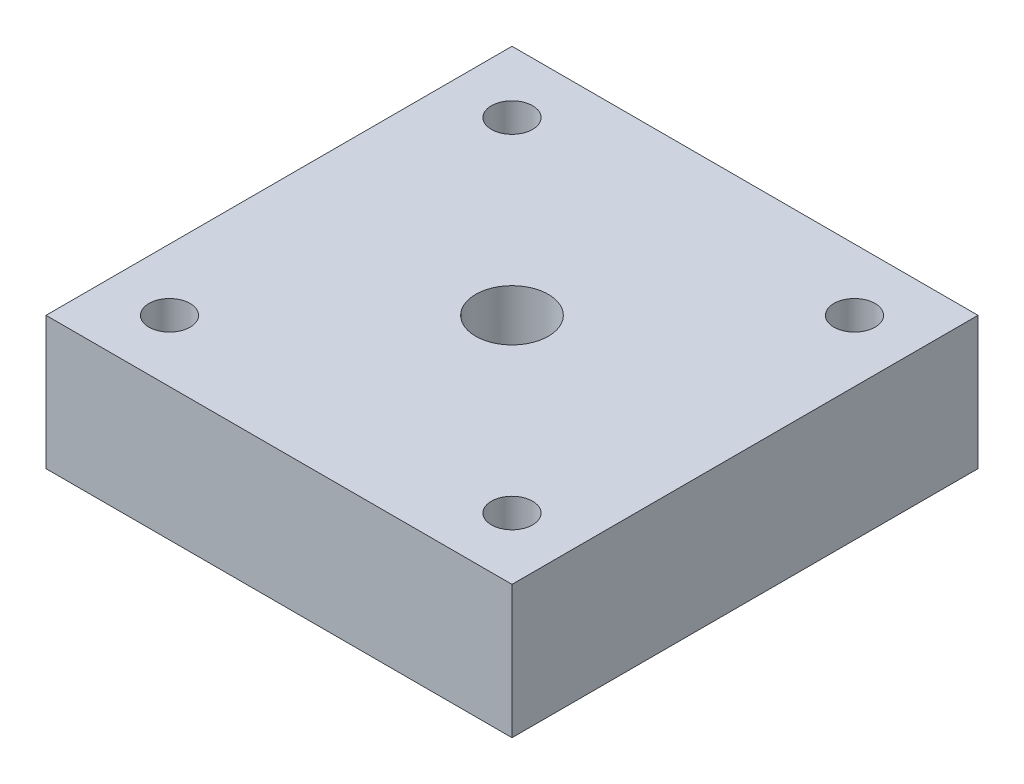
ISO-10303-21;
HEADER;
FILE_DESCRIPTION(('STEP AP214'),'2;1');
FILE_NAME('part.step','',(''),(''),'','','');
FILE_SCHEMA(('AUTOMOTIVE_DESIGN { 1 0 10303 214 1 1 1 1 }'));
ENDSEC;
DATA;
#1=APPLICATION_CONTEXT('core data for automotive mechanical design processes');
#2=APPLICATION_PROTOCOL_DEFINITION('international standard','automotive_design',2000,#1);
#3=PRODUCT_CONTEXT('',#1,'mechanical');
#4=PRODUCT('Part','Part','',(#3));
#5=PRODUCT_RELATED_PRODUCT_CATEGORY('part','',(#4));
#6=PRODUCT_DEFINITION_FORMATION('','',#4);
#7=PRODUCT_DEFINITION_CONTEXT('part definition',#1,'design');
#8=PRODUCT_DEFINITION('design','',#6,#7);
#9=PRODUCT_DEFINITION_SHAPE('','',#8);
#10=(LENGTH_UNIT() NAMED_UNIT(*) SI_UNIT(.MILLI.,.METRE.));
#11=(NAMED_UNIT(*) PLANE_ANGLE_UNIT() SI_UNIT($,.RADIAN.));
#12=(NAMED_UNIT(*) SI_UNIT($,.STERADIAN.) SOLID_ANGLE_UNIT());
#13=UNCERTAINTY_MEASURE_WITH_UNIT(LENGTH_MEASURE(1.E-05),#10,'distance_accuracy_value','');
#14=(GEOMETRIC_REPRESENTATION_CONTEXT(3) GLOBAL_UNCERTAINTY_ASSIGNED_CONTEXT((#13)) GLOBAL_UNIT_ASSIGNED_CONTEXT((#10,
#11,#12)) REPRESENTATION_CONTEXT('',''));
#15=CARTESIAN_POINT('',(0.,0.,0.));
#16=DIRECTION('',(0.,0.,1.));
#17=DIRECTION('',(1.,0.,0.));
#18=AXIS2_PLACEMENT_3D('',#15,#16,#17);
#19=CARTESIAN_POINT('',(0.,27.4254884463135,0.));
#20=DIRECTION('',(0.,1.,0.));
#21=DIRECTION('',(0.,0.,1.));
#22=AXIS2_PLACEMENT_3D('',#19,#20,#21);
#23=PLANE('',#22);
#24=CARTESIAN_POINT('',(0.,27.4254884463135,0.));
#25=DIRECTION('',(0.,1.,0.));
#26=DIRECTION('',(0.,0.,1.));
#27=AXIS2_PLACEMENT_3D('',#24,#25,#26);
#28=CIRCLE('',#27,7.5);
#29=CARTESIAN_POINT('',(0.,27.4254884463135,7.5));
#30=VERTEX_POINT('',#29);
#31=EDGE_CURVE('E154',#30,#30,#28,.T.);
#32=ORIENTED_EDGE('',*,*,#31,.F.);
#33=EDGE_LOOP('',(#32));
#34=FACE_BOUND('',#33,.T.);
#35=CARTESIAN_POINT('',(35.3553390593274,27.4254884463135,35.3553390593274));
#36=DIRECTION('',(0.,1.,0.));
#37=DIRECTION('',(0.,0.,1.));
#38=AXIS2_PLACEMENT_3D('',#35,#36,#37);
#39=CIRCLE('',#38,4.25000000000031);
#40=CARTESIAN_POINT('',(35.3553390593274,27.4254884463135,39.6053390593277));
#41=VERTEX_POINT('',#40);
#42=EDGE_CURVE('E115',#41,#41,#39,.T.);
#43=ORIENTED_EDGE('',*,*,#42,.F.);
#44=EDGE_LOOP('',(#43));
#45=FACE_BOUND('',#44,.T.);
#46=CARTESIAN_POINT('',(-35.3553390593274,27.4254884463135,-35.3553390593274));
#47=DIRECTION('',(0.,1.,0.));
#48=DIRECTION('',(0.,0.,1.));
#49=AXIS2_PLACEMENT_3D('',#46,#47,#48);
#50=CIRCLE('',#49,4.25);
#51=CARTESIAN_POINT('',(-35.3553390593274,27.4254884463135,-31.1053390593274));
#52=VERTEX_POINT('',#51);
#53=EDGE_CURVE('E127',#52,#52,#50,.T.);
#54=ORIENTED_EDGE('',*,*,#53,.F.);
#55=EDGE_LOOP('',(#54));
#56=FACE_BOUND('',#55,.T.);
#57=DIRECTION('',(0.,0.,-1.));
#58=VECTOR('',#57,1.);
#59=CARTESIAN_POINT('',(48.1053390593274,27.4254884463135,-48.1053390593274));
#60=LINE('',#59,#58);
#61=CARTESIAN_POINT('',(48.1053390593274,27.4254884463135,48.1053390593274));
#62=VERTEX_POINT('',#61);
#63=CARTESIAN_POINT('',(48.1053390593274,27.4254884463135,-48.1053390593274));
#64=VERTEX_POINT('',#63);
#65=EDGE_CURVE('E133',#62,#64,#60,.T.);
#66=ORIENTED_EDGE('',*,*,#65,.T.);
#67=DIRECTION('',(-1.,0.,0.));
#68=VECTOR('',#67,1.);
#69=CARTESIAN_POINT('',(-48.1053390593274,27.4254884463135,-48.1053390593274));
#70=LINE('',#69,#68);
#71=CARTESIAN_POINT('',(-48.1053390593274,27.4254884463135,-48.1053390593274));
#72=VERTEX_POINT('',#71);
#73=EDGE_CURVE('E88',#64,#72,#70,.T.);
#74=ORIENTED_EDGE('',*,*,#73,.T.);
#75=DIRECTION('',(0.,0.,1.));
#76=VECTOR('',#75,1.);
#77=CARTESIAN_POINT('',(-48.1053390593274,27.4254884463135,-48.1053390593274));
#78=LINE('',#77,#76);
#79=CARTESIAN_POINT('',(-48.1053390593274,27.4254884463135,48.1053390593274));
#80=VERTEX_POINT('',#79);
#81=EDGE_CURVE('E136',#72,#80,#78,.T.);
#82=ORIENTED_EDGE('',*,*,#81,.T.);
#83=DIRECTION('',(1.,0.,0.));
#84=VECTOR('',#83,1.);
#85=CARTESIAN_POINT('',(-48.1053390593274,27.4254884463135,48.1053390593274));
#86=LINE('',#85,#84);
#87=EDGE_CURVE('E59',#80,#62,#86,.T.);
#88=ORIENTED_EDGE('',*,*,#87,.T.);
#89=EDGE_LOOP('',(#66,#74,#82,#88));
#90=FACE_BOUND('',#89,.T.);
#91=CARTESIAN_POINT('',(35.3553390593274,27.4254884463135,-35.3553390593274));
#92=DIRECTION('',(0.,1.,0.));
#93=DIRECTION('',(0.,0.,1.));
#94=AXIS2_PLACEMENT_3D('',#91,#92,#93);
#95=CIRCLE('',#94,4.25000000000015);
#96=CARTESIAN_POINT('',(35.3553390593274,27.4254884463135,-31.1053390593272));
#97=VERTEX_POINT('',#96);
#98=EDGE_CURVE('E121',#97,#97,#95,.T.);
#99=ORIENTED_EDGE('',*,*,#98,.F.);
#100=EDGE_LOOP('',(#99));
#101=FACE_BOUND('',#100,.T.);
#102=CARTESIAN_POINT('',(-35.3553390593274,27.4254884463135,35.3553390593274));
#103=DIRECTION('',(0.,1.,0.));
#104=DIRECTION('',(0.,0.,1.));
#105=AXIS2_PLACEMENT_3D('',#102,#103,#104);
#106=CIRCLE('',#105,4.25000000000047);
#107=CARTESIAN_POINT('',(-35.3553390593274,27.4254884463135,39.6053390593279));
#108=VERTEX_POINT('',#107);
#109=EDGE_CURVE('E105',#108,#108,#106,.T.);
#110=ORIENTED_EDGE('',*,*,#109,.F.);
#111=EDGE_LOOP('',(#110));
#112=FACE_BOUND('',#111,.T.);
#113=ADVANCED_FACE('F33',(#34,#45,#56,#90,#101,#112),#23,.T.);
#114=CARTESIAN_POINT('',(0.,0.,0.));
#115=DIRECTION('',(0.,1.,0.));
#116=DIRECTION('',(0.,0.,1.));
#117=AXIS2_PLACEMENT_3D('',#114,#115,#116);
#118=PLANE('',#117);
#119=CARTESIAN_POINT('',(0.,0.,0.));
#120=DIRECTION('',(0.,-1.,0.));
#121=DIRECTION('',(1.,0.,0.));
#122=AXIS2_PLACEMENT_3D('',#119,#120,#121);
#123=CIRCLE('',#122,22.725);
#124=CARTESIAN_POINT('',(22.725,0.,0.));
#125=VERTEX_POINT('',#124);
#126=EDGE_CURVE('E102',#125,#125,#123,.T.);
#127=ORIENTED_EDGE('',*,*,#126,.F.);
#128=EDGE_LOOP('',(#127));
#129=FACE_BOUND('',#128,.T.);
#130=DIRECTION('',(0.,0.,-1.));
#131=VECTOR('',#130,1.);
#132=CARTESIAN_POINT('',(48.1053390593274,0.,-48.1053390593274));
#133=LINE('',#132,#131);
#134=CARTESIAN_POINT('',(48.1053390593274,0.,48.1053390593274));
#135=VERTEX_POINT('',#134);
#136=CARTESIAN_POINT('',(48.1053390593274,0.,-48.1053390593274));
#137=VERTEX_POINT('',#136);
#138=EDGE_CURVE('E130',#135,#137,#133,.T.);
#139=ORIENTED_EDGE('',*,*,#138,.F.);
#140=DIRECTION('',(1.,0.,0.));
#141=VECTOR('',#140,1.);
#142=CARTESIAN_POINT('',(-48.1053390593274,0.,48.1053390593274));
#143=LINE('',#142,#141);
#144=CARTESIAN_POINT('',(-48.1053390593274,0.,48.1053390593274));
#145=VERTEX_POINT('',#144);
#146=EDGE_CURVE('E80',#145,#135,#143,.T.);
#147=ORIENTED_EDGE('',*,*,#146,.F.);
#148=DIRECTION('',(0.,0.,1.));
#149=VECTOR('',#148,1.);
#150=CARTESIAN_POINT('',(-48.1053390593274,0.,-48.1053390593274));
#151=LINE('',#150,#149);
#152=CARTESIAN_POINT('',(-48.1053390593274,0.,-48.1053390593274));
#153=VERTEX_POINT('',#152);
#154=EDGE_CURVE('E144',#153,#145,#151,.T.);
#155=ORIENTED_EDGE('',*,*,#154,.F.);
#156=DIRECTION('',(-1.,0.,0.));
#157=VECTOR('',#156,1.);
#158=CARTESIAN_POINT('',(-48.1053390593274,0.,-48.1053390593274));
#159=LINE('',#158,#157);
#160=EDGE_CURVE('E142',#137,#153,#159,.T.);
#161=ORIENTED_EDGE('',*,*,#160,.F.);
#162=EDGE_LOOP('',(#139,#147,#155,#161));
#163=FACE_BOUND('',#162,.T.);
#164=CARTESIAN_POINT('',(-35.3553390593274,0.,-35.3553390593274));
#165=DIRECTION('',(0.,1.,0.));
#166=DIRECTION('',(0.,0.,1.));
#167=AXIS2_PLACEMENT_3D('',#164,#165,#166);
#168=CIRCLE('',#167,4.25);
#169=CARTESIAN_POINT('',(-35.3553390593274,0.,-31.1053390593274));
#170=VERTEX_POINT('',#169);
#171=EDGE_CURVE('E124',#170,#170,#168,.T.);
#172=ORIENTED_EDGE('',*,*,#171,.T.);
#173=EDGE_LOOP('',(#172));
#174=FACE_BOUND('',#173,.T.);
#175=CARTESIAN_POINT('',(35.3553390593274,0.,-35.3553390593274));
#176=DIRECTION('',(0.,1.,0.));
#177=DIRECTION('',(0.,0.,1.));
#178=AXIS2_PLACEMENT_3D('',#175,#176,#177);
#179=CIRCLE('',#178,4.25000000000015);
#180=CARTESIAN_POINT('',(35.3553390593274,0.,-31.1053390593272));
#181=VERTEX_POINT('',#180);
#182=EDGE_CURVE('E118',#181,#181,#179,.T.);
#183=ORIENTED_EDGE('',*,*,#182,.T.);
#184=EDGE_LOOP('',(#183));
#185=FACE_BOUND('',#184,.T.);
#186=CARTESIAN_POINT('',(35.3553390593274,0.,35.3553390593274));
#187=DIRECTION('',(0.,1.,0.));
#188=DIRECTION('',(0.,0.,1.));
#189=AXIS2_PLACEMENT_3D('',#186,#187,#188);
#190=CIRCLE('',#189,4.25000000000031);
#191=CARTESIAN_POINT('',(35.3553390593274,0.,39.6053390593277));
#192=VERTEX_POINT('',#191);
#193=EDGE_CURVE('E113',#192,#192,#190,.T.);
#194=ORIENTED_EDGE('',*,*,#193,.T.);
#195=EDGE_LOOP('',(#194));
#196=FACE_BOUND('',#195,.T.);
#197=CARTESIAN_POINT('',(-35.3553390593274,0.,35.3553390593274));
#198=DIRECTION('',(0.,1.,0.));
#199=DIRECTION('',(0.,0.,1.));
#200=AXIS2_PLACEMENT_3D('',#197,#198,#199);
#201=CIRCLE('',#200,4.25000000000047);
#202=CARTESIAN_POINT('',(-35.3553390593274,0.,39.6053390593279));
#203=VERTEX_POINT('',#202);
#204=EDGE_CURVE('E101',#203,#203,#201,.T.);
#205=ORIENTED_EDGE('',*,*,#204,.T.);
#206=EDGE_LOOP('',(#205));
#207=FACE_BOUND('',#206,.T.);
#208=ADVANCED_FACE('F175',(#129,#163,#174,#185,#196,#207),#118,.F.);
#209=CARTESIAN_POINT('',(48.1053390593274,27.4254884463135,-48.1053390593274));
#210=DIRECTION('',(-1.,0.,0.));
#211=DIRECTION('',(0.,0.,1.));
#212=AXIS2_PLACEMENT_3D('',#209,#210,#211);
#213=PLANE('',#212);
#214=ORIENTED_EDGE('',*,*,#138,.T.);
#215=DIRECTION('',(0.,-1.,0.));
#216=VECTOR('',#215,1.);
#217=CARTESIAN_POINT('',(48.1053390593274,27.4254884463135,-48.1053390593274));
#218=LINE('',#217,#216);
#219=EDGE_CURVE('E94',#64,#137,#218,.T.);
#220=ORIENTED_EDGE('',*,*,#219,.F.);
#221=ORIENTED_EDGE('',*,*,#65,.F.);
#222=DIRECTION('',(0.,-1.,0.));
#223=VECTOR('',#222,1.);
#224=CARTESIAN_POINT('',(48.1053390593274,27.4254884463135,48.1053390593274));
#225=LINE('',#224,#223);
#226=EDGE_CURVE('E139',#62,#135,#225,.T.);
#227=ORIENTED_EDGE('',*,*,#226,.T.);
#228=EDGE_LOOP('',(#214,#220,#221,#227));
#229=FACE_BOUND('',#228,.T.);
#230=ADVANCED_FACE('F35',(#229),#213,.F.);
#231=CARTESIAN_POINT('',(-48.1053390593274,27.4254884463135,-48.1053390593274));
#232=DIRECTION('',(0.,0.,1.));
#233=DIRECTION('',(1.,0.,0.));
#234=AXIS2_PLACEMENT_3D('',#231,#232,#233);
#235=PLANE('',#234);
#236=ORIENTED_EDGE('',*,*,#160,.T.);
#237=DIRECTION('',(0.,-1.,0.));
#238=VECTOR('',#237,1.);
#239=CARTESIAN_POINT('',(-48.1053390593274,27.4254884463135,-48.1053390593274));
#240=LINE('',#239,#238);
#241=EDGE_CURVE('E150',#72,#153,#240,.T.);
#242=ORIENTED_EDGE('',*,*,#241,.F.);
#243=ORIENTED_EDGE('',*,*,#73,.F.);
#244=ORIENTED_EDGE('',*,*,#219,.T.);
#245=EDGE_LOOP('',(#236,#242,#243,#244));
#246=FACE_BOUND('',#245,.T.);
#247=ADVANCED_FACE('F192',(#246),#235,.F.);
#248=CARTESIAN_POINT('',(-48.1053390593274,27.4254884463135,-48.1053390593274));
#249=DIRECTION('',(1.,0.,0.));
#250=DIRECTION('',(0.,0.,-1.));
#251=AXIS2_PLACEMENT_3D('',#248,#249,#250);
#252=PLANE('',#251);
#253=CARTESIAN_POINT('',(-48.1053390593274,6.67500000000001,19.55));
#254=DIRECTION('',(1.,0.,0.));
#255=DIRECTION('',(0.,0.,-1.));
#256=AXIS2_PLACEMENT_3D('',#253,#254,#255);
#257=CIRCLE('',#256,3.175);
#258=CARTESIAN_POINT('',(-48.1053390593274,6.67500000000001,16.375));
#259=VERTEX_POINT('',#258);
#260=EDGE_CURVE('E158',#259,#259,#257,.T.);
#261=ORIENTED_EDGE('',*,*,#260,.T.);
#262=EDGE_LOOP('',(#261));
#263=FACE_BOUND('',#262,.T.);
#264=ORIENTED_EDGE('',*,*,#154,.T.);
#265=DIRECTION('',(0.,-1.,0.));
#266=VECTOR('',#265,1.);
#267=CARTESIAN_POINT('',(-48.1053390593274,27.4254884463135,48.1053390593274));
#268=LINE('',#267,#266);
#269=EDGE_CURVE('E148',#80,#145,#268,.T.);
#270=ORIENTED_EDGE('',*,*,#269,.F.);
#271=ORIENTED_EDGE('',*,*,#81,.F.);
#272=ORIENTED_EDGE('',*,*,#241,.T.);
#273=EDGE_LOOP('',(#264,#270,#271,#272));
#274=FACE_BOUND('',#273,.T.);
#275=ADVANCED_FACE('F165',(#263,#274),#252,.F.);
#276=CARTESIAN_POINT('',(-48.1053390593274,27.4254884463135,48.1053390593274));
#277=DIRECTION('',(0.,0.,-1.));
#278=DIRECTION('',(-1.,0.,0.));
#279=AXIS2_PLACEMENT_3D('',#276,#277,#278);
#280=PLANE('',#279);
#281=ORIENTED_EDGE('',*,*,#146,.T.);
#282=ORIENTED_EDGE('',*,*,#226,.F.);
#283=ORIENTED_EDGE('',*,*,#87,.F.);
#284=ORIENTED_EDGE('',*,*,#269,.T.);
#285=EDGE_LOOP('',(#281,#282,#283,#284));
#286=FACE_BOUND('',#285,.T.);
#287=ADVANCED_FACE('F188',(#286),#280,.F.);
#288=CARTESIAN_POINT('',(-35.3553390593274,27.4254884463135,-35.3553390593274));
#289=DIRECTION('',(0.,-1.,0.));
#290=DIRECTION('',(0.,0.,-1.));
#291=AXIS2_PLACEMENT_3D('',#288,#289,#290);
#292=CYLINDRICAL_SURFACE('',#291,4.25);
#293=ORIENTED_EDGE('',*,*,#53,.T.);
#294=EDGE_LOOP('',(#293));
#295=FACE_BOUND('',#294,.T.);
#296=ORIENTED_EDGE('',*,*,#171,.F.);
#297=EDGE_LOOP('',(#296));
#298=FACE_BOUND('',#297,.T.);
#299=ADVANCED_FACE('F185',(#295,#298),#292,.F.);
#300=CARTESIAN_POINT('',(35.3553390593274,27.4254884463135,-35.3553390593274));
#301=DIRECTION('',(0.,-1.,0.));
#302=DIRECTION('',(0.,0.,-1.));
#303=AXIS2_PLACEMENT_3D('',#300,#301,#302);
#304=CYLINDRICAL_SURFACE('',#303,4.25000000000015);
#305=ORIENTED_EDGE('',*,*,#98,.T.);
#306=EDGE_LOOP('',(#305));
#307=FACE_BOUND('',#306,.T.);
#308=ORIENTED_EDGE('',*,*,#182,.F.);
#309=EDGE_LOOP('',(#308));
#310=FACE_BOUND('',#309,.T.);
#311=ADVANCED_FACE('F223',(#307,#310),#304,.F.);
#312=CARTESIAN_POINT('',(35.3553390593274,27.4254884463135,35.3553390593274));
#313=DIRECTION('',(0.,-1.,0.));
#314=DIRECTION('',(0.,0.,-1.));
#315=AXIS2_PLACEMENT_3D('',#312,#313,#314);
#316=CYLINDRICAL_SURFACE('',#315,4.25000000000031);
#317=ORIENTED_EDGE('',*,*,#42,.T.);
#318=EDGE_LOOP('',(#317));
#319=FACE_BOUND('',#318,.T.);
#320=ORIENTED_EDGE('',*,*,#193,.F.);
#321=EDGE_LOOP('',(#320));
#322=FACE_BOUND('',#321,.T.);
#323=ADVANCED_FACE('F214',(#319,#322),#316,.F.);
#324=CARTESIAN_POINT('',(-35.3553390593274,27.4254884463135,35.3553390593274));
#325=DIRECTION('',(0.,-1.,0.));
#326=DIRECTION('',(0.,0.,-1.));
#327=AXIS2_PLACEMENT_3D('',#324,#325,#326);
#328=CYLINDRICAL_SURFACE('',#327,4.25000000000047);
#329=ORIENTED_EDGE('',*,*,#109,.T.);
#330=EDGE_LOOP('',(#329));
#331=FACE_BOUND('',#330,.T.);
#332=ORIENTED_EDGE('',*,*,#204,.F.);
#333=EDGE_LOOP('',(#332));
#334=FACE_BOUND('',#333,.T.);
#335=ADVANCED_FACE('F211',(#331,#334),#328,.F.);
#336=CARTESIAN_POINT('',(0.,9.85000000000002,0.));
#337=DIRECTION('',(0.,-1.,0.));
#338=DIRECTION('',(1.,0.,0.));
#339=AXIS2_PLACEMENT_3D('',#336,#337,#338);
#340=CONICAL_SURFACE('',#339,22.725,1.17200974649418);
#341=CARTESIAN_POINT('',(0.,16.2652612363091,0.));
#342=DIRECTION('',(0.,-1.,0.));
#343=DIRECTION('',(1.,0.,0.));
#344=AXIS2_PLACEMENT_3D('',#341,#342,#343);
#345=CIRCLE('',#344,7.5);
#346=CARTESIAN_POINT('',(7.5,16.2652612363091,0.));
#347=VERTEX_POINT('',#346);
#348=EDGE_CURVE('E108',#347,#347,#345,.F.);
#349=ORIENTED_EDGE('',*,*,#348,.T.);
#350=EDGE_LOOP('',(#349));
#351=FACE_BOUND('',#350,.T.);
#352=CARTESIAN_POINT('',(0.,9.85000000000002,0.));
#353=DIRECTION('',(0.,-1.,0.));
#354=DIRECTION('',(1.,0.,0.));
#355=AXIS2_PLACEMENT_3D('',#352,#353,#354);
#356=CIRCLE('',#355,22.725);
#357=CARTESIAN_POINT('',(-11.5854704263575,9.85000000000002,19.5499999999999));
#358=VERTEX_POINT('',#357);
#359=EDGE_CURVE('E98',#358,#358,#356,.T.);
#360=ORIENTED_EDGE('',*,*,#359,.T.);
#361=EDGE_LOOP('',(#360));
#362=FACE_BOUND('',#361,.T.);
#363=ADVANCED_FACE('F100',(#351,#362),#340,.F.);
#364=CARTESIAN_POINT('',(0.,0.,0.));
#365=DIRECTION('',(0.,-1.,0.));
#366=DIRECTION('',(1.,0.,0.));
#367=AXIS2_PLACEMENT_3D('',#364,#365,#366);
#368=CYLINDRICAL_SURFACE('',#367,22.725);
#369=CARTESIAN_POINT('',(0.,6.67500000000001,22.725));
#370=CARTESIAN_POINT('',(-1.86483595557603E-07,6.67513816227694,22.725));
#371=CARTESIAN_POINT('',(-0.0006086128472381,6.67527632276767,22.7249999910121));
#372=CARTESIAN_POINT('',(-0.00204807475040465,6.67567551812113,22.7249999391048));
#373=CARTESIAN_POINT('',(-0.00259642637569137,6.67593663554969,22.7249998731292));
#374=CARTESIAN_POINT('',(-0.00494584041344816,6.67695605210977,22.7249994898257));
#375=CARTESIAN_POINT('',(-0.00714042408363435,6.67771214959241,22.7249989330991));
#376=CARTESIAN_POINT('',(-0.0159511800406587,6.68082772205191,22.7249955238241));
#377=CARTESIAN_POINT('',(-0.0220894481912201,6.68319198033877,22.7249903061333));
#378=CARTESIAN_POINT('',(-0.160771856226293,6.7364871292866,22.7248132415199));
#379=CARTESIAN_POINT('',(-0.299588267107428,6.78735354669026,22.7234202897069));
#380=CARTESIAN_POINT('',(-0.575940933371699,6.88980546350621,22.7181463531109));
#381=CARTESIAN_POINT('',(-0.713425653481682,6.94139014007111,22.7142278699352));
#382=CARTESIAN_POINT('',(-0.983299171102172,7.04213184963213,22.7040911185908));
#383=CARTESIAN_POINT('',(-1.11564899444933,7.09129672651965,22.6979804945593));
#384=CARTESIAN_POINT('',(-1.3795453863643,7.18919602327661,22.6834750125073));
#385=CARTESIAN_POINT('',(-1.51109304386387,7.23793137923632,22.6750894476926));
#386=CARTESIAN_POINT('',(-1.79028032455153,7.34103334050994,22.6548529612834));
#387=CARTESIAN_POINT('',(-1.93792081582178,7.39535986188021,22.6427036885701));
#388=CARTESIAN_POINT('',(-2.2332618308777,7.50357511280985,22.615486016846));
#389=CARTESIAN_POINT('',(-2.38096223363702,7.55746327759688,22.6004143311353));
#390=CARTESIAN_POINT('',(-2.82683836290616,7.71927390572622,22.5504909689289));
#391=CARTESIAN_POINT('',(-3.1248730644813,7.8262615398646,22.5111412562868));
#392=CARTESIAN_POINT('',(-3.64256848597146,8.00927961894046,22.4322722284788));
#393=CARTESIAN_POINT('',(-3.86237296543829,8.08609874583734,22.3954802498856));
#394=CARTESIAN_POINT('',(-4.30103095212614,8.23723407831488,22.3153834948457));
#395=CARTESIAN_POINT('',(-4.51988546403838,8.31155604605351,22.2720951828671));
#396=CARTESIAN_POINT('',(-4.95220024206843,8.45580864101001,22.1799252162967));
#397=CARTESIAN_POINT('',(-5.16567142441871,8.52580036705527,22.1311907476928));
#398=CARTESIAN_POINT('',(-5.59217856464385,8.66272827246951,22.0272870752469));
#399=CARTESIAN_POINT('',(-5.80521415664846,8.72966246811374,21.9721137741365));
#400=CARTESIAN_POINT('',(-6.40707458604961,8.91396762373065,21.8068305060273));
#401=CARTESIAN_POINT('',(-6.79515076088577,9.0271264598032,21.6891100536541));
#402=CARTESIAN_POINT('',(-7.57067742876471,9.2384540818099,21.4307866028974));
#403=CARTESIAN_POINT('',(-7.95810839309649,9.33652339215006,21.2900434040333));
#404=CARTESIAN_POINT('',(-8.74931605080284,9.5169102129457,20.9777331560205));
#405=CARTESIAN_POINT('',(-9.15286905427343,9.59811558370146,20.8049266857827));
#406=CARTESIAN_POINT('',(-9.75266574356291,9.69752031607531,20.5270458953552));
#407=CARTESIAN_POINT('',(-9.95148517434898,9.72690361659591,20.4314091632833));
#408=CARTESIAN_POINT('',(-10.3470962383102,9.77713590172361,20.2339334843129));
#409=CARTESIAN_POINT('',(-10.5438882733212,9.79798661052268,20.1320957952328));
#410=CARTESIAN_POINT('',(-10.910852367264,9.82790300278704,19.93531432997));
#411=CARTESIAN_POINT('',(-11.0813084585552,9.83810672353207,19.8410740809574));
#412=CARTESIAN_POINT('',(-11.4200066493414,9.84995755710642,19.6480803593879));
#413=CARTESIAN_POINT('',(-11.5882483818182,9.85160326887027,19.5493261505023));
#414=CARTESIAN_POINT('',(-11.920758568905,9.84517268589661,19.3483485152955));
#415=CARTESIAN_POINT('',(-12.0850473751677,9.83716931856558,19.2461567166078));
#416=CARTESIAN_POINT('',(-12.4103324591323,9.81020686986361,19.038028879735));
#417=CARTESIAN_POINT('',(-12.571329044908,9.79124881849345,18.9320931944433));
#418=CARTESIAN_POINT('',(-12.8922094402801,9.74032378701629,18.7150942162695));
#419=CARTESIAN_POINT('',(-13.0520173151613,9.70812220000866,18.6039722770467));
#420=CARTESIAN_POINT('',(-13.366376938986,9.62873433657482,18.3794151424961));
#421=CARTESIAN_POINT('',(-13.5209264428183,9.58154174632082,18.2659789913534));
#422=CARTESIAN_POINT('',(-13.8227654180766,9.4700649231619,18.0386352579535));
#423=CARTESIAN_POINT('',(-13.9700735513393,9.40582768537281,17.924729807076));
#424=CARTESIAN_POINT('',(-14.2556101159739,9.25778219542639,17.69848287362));
#425=CARTESIAN_POINT('',(-14.3938505201508,9.17400044408951,17.5861394896396));
#426=CARTESIAN_POINT('',(-14.6482739718299,8.99156500796547,17.3746625924567));
#427=CARTESIAN_POINT('',(-14.7653361285345,8.89456582067223,17.2751798820671));
#428=CARTESIAN_POINT('',(-14.986279901791,8.67986642426915,17.0838632300585));
#429=CARTESIAN_POINT('',(-15.0901598728553,8.56216363516583,16.9920302438192));
#430=CARTESIAN_POINT('',(-15.2818411203208,8.30329046815007,16.8198620160663));
#431=CARTESIAN_POINT('',(-15.3694200110413,8.16183947138238,16.7396886654553));
#432=CARTESIAN_POINT('',(-15.4832335821333,7.93434377220528,16.6342362564726));
#433=CARTESIAN_POINT('',(-15.5182328994779,7.85600044036578,16.6015656698964));
#434=CARTESIAN_POINT('',(-15.5817524913907,7.6946663234527,16.541961733008));
#435=CARTESIAN_POINT('',(-15.6102760187158,7.61167789781595,16.5150255027828));
#436=CARTESIAN_POINT('',(-15.6699216990296,7.40856202856283,16.4584779271861));
#437=CARTESIAN_POINT('',(-15.6977255586639,7.28656354487355,16.4319140627231));
#438=CARTESIAN_POINT('',(-15.7380489007885,7.03788166186598,16.3932985665883));
#439=CARTESIAN_POINT('',(-15.7505776073275,6.91120113751309,16.3812381769135));
#440=CARTESIAN_POINT('',(-15.7596663573243,6.65650315480537,16.3724948211292));
#441=CARTESIAN_POINT('',(-15.7561991425627,6.52848378551125,16.3758381039913));
#442=CARTESIAN_POINT('',(-15.7334378986453,6.27519349347496,16.3977070049736));
#443=CARTESIAN_POINT('',(-15.7141412504631,6.14992302906903,16.416235135471));
#444=CARTESIAN_POINT('',(-15.6613027465996,5.90780571561791,16.4666481851984));
#445=CARTESIAN_POINT('',(-15.6280300285901,5.79084615809898,16.4982806040561));
#446=CARTESIAN_POINT('',(-15.5488652966861,5.56517129743241,16.572910754539));
#447=CARTESIAN_POINT('',(-15.5029681798514,5.45645935079143,16.6159130817507));
#448=CARTESIAN_POINT('',(-15.3804209944833,5.2084584333717,16.7295432576918));
#449=CARTESIAN_POINT('',(-15.2987415425096,5.07359580121571,16.8044240897052));
#450=CARTESIAN_POINT('',(-15.1189803352894,4.82361188172242,16.9663427963249));
#451=CARTESIAN_POINT('',(-15.0208685231504,4.7085275676088,17.0534028994098));
#452=CARTESIAN_POINT('',(-14.768538070043,4.45364246057624,17.2729260805997));
#453=CARTESIAN_POINT('',(-14.6079469211553,4.3234452639951,17.4092220757678));
#454=CARTESIAN_POINT('',(-14.3541076122482,4.15379552337051,17.618101239126));
#455=CARTESIAN_POINT('',(-14.2671894816523,4.10145822334785,17.6885806435965));
#456=CARTESIAN_POINT('',(-14.0896574093591,4.00467201430922,17.8303119970662));
#457=CARTESIAN_POINT('',(-13.9990441245241,3.96022171072872,17.901563807121));
#458=CARTESIAN_POINT('',(-13.7605990406061,3.85461933844444,18.0860642319066));
#459=CARTESIAN_POINT('',(-13.6104034152016,3.79898018894016,18.1994130328314));
#460=CARTESIAN_POINT('',(-13.3039478560647,3.70361742810874,18.4246254626177));
#461=CARTESIAN_POINT('',(-13.1476843697916,3.66390329930086,18.5364881683754));
#462=CARTESIAN_POINT('',(-12.8307642320159,3.59841170064828,18.7572473432775));
#463=CARTESIAN_POINT('',(-12.6701174070096,3.57260537981982,18.8661495045052));
#464=CARTESIAN_POINT('',(-12.3450297233092,3.53302255454644,19.0804565898831));
#465=CARTESIAN_POINT('',(-12.1805875517222,3.5192502789506,19.1858602721358));
#466=CARTESIAN_POINT('',(-11.7312125717661,3.49617162629439,19.4657545519386));
#467=CARTESIAN_POINT('',(-11.4433303695295,3.4969155055397,19.6363742491265));
#468=CARTESIAN_POINT('',(-10.8610898298626,3.52285536915081,19.96432448107));
#469=CARTESIAN_POINT('',(-10.5667263984233,3.54807131070493,20.1216440556162));
#470=CARTESIAN_POINT('',(-9.96698905374138,3.61902086146692,20.4254776607463));
#471=CARTESIAN_POINT('',(-9.66151417017493,3.66518009735765,20.5716901223838));
#472=CARTESIAN_POINT('',(-9.04708822829937,3.77415684323161,20.8492067328559));
#473=CARTESIAN_POINT('',(-8.73813940372021,3.83696417624557,20.9805199198101));
#474=CARTESIAN_POINT('',(-8.15326637889661,3.96810910617502,21.2140816031315));
#475=CARTESIAN_POINT('',(-7.87764665387,4.03497146978718,21.3179354071394));
#476=CARTESIAN_POINT('',(-7.32462350993108,4.17756604323483,21.5142193585749));
#477=CARTESIAN_POINT('',(-7.04721981795078,4.25329964305896,21.6066477111313));
#478=CARTESIAN_POINT('',(-6.21117484734397,4.49200562475753,21.8675208612083));
#479=CARTESIAN_POINT('',(-5.65029832471654,4.66610750148761,22.0189183303275));
#480=CARTESIAN_POINT('',(-4.57739803164741,5.01702271479919,22.2653855210136));
#481=CARTESIAN_POINT('',(-4.06567331222652,5.19208356440757,22.3643798761005));
#482=CARTESIAN_POINT('',(-3.04556232193781,5.55105493147932,22.525851341711));
#483=CARTESIAN_POINT('',(-2.53719601229091,5.73485562427626,22.5886943567453));
#484=CARTESIAN_POINT('',(-1.88828488070352,5.97289952224963,22.6468501792043));
#485=CARTESIAN_POINT('',(-1.74806480725181,6.0245412923547,22.6581042334307));
#486=CARTESIAN_POINT('',(-1.46375133554739,6.12957023863964,22.6782691369944));
#487=CARTESIAN_POINT('',(-1.31965562690775,6.18296688012397,22.6871084765575));
#488=CARTESIAN_POINT('',(-1.07478126711774,6.27394458155774,22.6997950963264));
#489=CARTESIAN_POINT('',(-0.973991994936108,6.31145864594575,22.704344338027));
#490=CARTESIAN_POINT('',(-0.773245697091263,6.38619711225484,22.7120586836223));
#491=CARTESIAN_POINT('',(-0.673290680501016,6.42342056115635,22.7152374449353));
#492=CARTESIAN_POINT('',(-0.484689359402918,6.49395415821705,22.7200093116143));
#493=CARTESIAN_POINT('',(-0.395975949800671,6.52725744437663,22.7217355573455));
#494=CARTESIAN_POINT('',(-0.21290844052132,6.5951738958445,22.7241855201154));
#495=CARTESIAN_POINT('',(-0.11846951891501,6.62978726045096,22.7248673092081));
#496=CARTESIAN_POINT('',(-0.0220940755757974,6.66680503172174,22.7249902962999));
#497=CARTESIAN_POINT('',(-0.0159664353882453,6.66916636378097,22.7249955107299));
#498=CARTESIAN_POINT('',(-0.00715791238575269,6.67228120015064,22.7249989279583));
#499=CARTESIAN_POINT('',(-0.00495634969311709,6.67303952756551,22.7249994876596));
#500=CARTESIAN_POINT('',(-0.002600942794774,6.67406178870093,22.7249998727196));
#501=CARTESIAN_POINT('',(-0.00205156121373354,6.67432349828132,22.7249999389473));
#502=CARTESIAN_POINT('',(-0.000608991025270847,6.67472341835311,22.7249999909955));
#503=CARTESIAN_POINT('',(1.86655883562581E-07,6.67486171007131,22.725));
#504=CARTESIAN_POINT('',(0.,6.67500000000001,22.725));
#505=B_SPLINE_CURVE_WITH_KNOTS('',3,(#369,#370,#371,#372,#373,#374,#375,#376,#377,#378,#379,
#380,#381,#382,#383,#384,#385,#386,#387,#388,#389,#390,#391,#392,#393,#394,#395,#396,#397,#398,
#399,#400,#401,#402,#403,#404,#405,#406,#407,#408,#409,#410,#411,#412,#413,#414,#415,#416,#417,
#418,#419,#420,#421,#422,#423,#424,#425,#426,#427,#428,#429,#430,#431,#432,#433,#434,#435,#436,
#437,#438,#439,#440,#441,#442,#443,#444,#445,#446,#447,#448,#449,#450,#451,#452,#453,#454,#455,
#456,#457,#458,#459,#460,#461,#462,#463,#464,#465,#466,#467,#468,#469,#470,#471,#472,#473,#474,
#475,#476,#477,#478,#479,#480,#481,#482,#483,#484,#485,#486,#487,#488,#489,#490,#491,#492,#493,
#494,#495,#496,#497,#498,#499,#500,#501,#502,#503,#504),.UNSPECIFIED.,.T.,.F.,(4,2,2,2,2,2,2,2,
2,2,2,2,2,2,2,2,2,2,2,2,2,2,2,2,2,2,2,2,2,2,2,2,2,2,2,2,2,2,2,2,2,2,2,2,2,2,2,2,2,2,2,2,2,2,2,2,
2,2,2,2,2,2,2,2,2,2,2,4),(0.,0.00118199042005903,0.00341440063714662,0.00990730342068791,
0.0301496341488772,0.466237123965799,0.908953521498257,1.33238011651694,1.75410238899192,
2.22739035605348,2.70121372783067,3.65820608475308,4.36530662272507,5.07064442250674,
5.76016629277275,6.45012934879295,7.71234834667395,8.98256137385481,10.3201839670422,
10.9876982659137,11.6550776126137,12.2399745492645,12.8249672386892,13.405566153069,
13.9861104862256,14.5774151790405,15.1689692452336,15.7589089413198,16.3480533279616,
16.8915663409849,17.4351471322998,17.9856729540192,18.2606688368355,18.5355262834806,
18.9174847733281,19.2992124994359,19.6815909575423,20.0640326940552,20.4394249016247,
20.8149690709822,21.3356942373238,21.8573824922839,22.5958697918761,22.9662749338003,
23.3366145159441,23.9243503072966,24.5124355468254,25.0992960935499,25.6863627844021,
26.6887015708739,27.6918584611671,28.7163846870162,29.740286059366,30.645997233492,
31.5518505091733,33.3688195643241,35.0170947448375,36.6483793429329,37.0979317867794,
37.5596280932967,37.8826457395376,38.2023654749666,38.4879214991379,38.7846653472114,
38.8048822855563,38.8113944540247,38.8136318988888,38.814814981381),.UNSPECIFIED.);
#506=CARTESIAN_POINT('',(0.,6.67500000000001,22.725));
#507=VERTEX_POINT('',#506);
#508=EDGE_CURVE('E37',#358,#507,#505,.T.);
#509=ORIENTED_EDGE('',*,*,#508,.T.);
#510=EDGE_CURVE('E11',#507,#358,#505,.T.);
#511=ORIENTED_EDGE('',*,*,#510,.T.);
#512=ORIENTED_EDGE('',*,*,#359,.F.);
#513=EDGE_LOOP('',(#509,#511,#512));
#514=FACE_BOUND('',#513,.T.);
#515=ORIENTED_EDGE('',*,*,#126,.T.);
#516=EDGE_LOOP('',(#515));
#517=FACE_BOUND('',#516,.T.);
#518=ADVANCED_FACE('F96',(#514,#517),#368,.F.);
#519=CARTESIAN_POINT('',(0.,0.,0.));
#520=DIRECTION('',(0.,1.,0.));
#521=DIRECTION('',(0.,0.,1.));
#522=AXIS2_PLACEMENT_3D('',#519,#520,#521);
#523=CYLINDRICAL_SURFACE('',#522,7.5);
#524=ORIENTED_EDGE('',*,*,#31,.T.);
#525=EDGE_LOOP('',(#524));
#526=FACE_BOUND('',#525,.T.);
#527=ORIENTED_EDGE('',*,*,#348,.F.);
#528=EDGE_LOOP('',(#527));
#529=FACE_BOUND('',#528,.T.);
#530=ADVANCED_FACE('F168',(#526,#529),#523,.F.);
#531=CARTESIAN_POINT('',(-100.,6.67500000000001,19.55));
#532=DIRECTION('',(1.,0.,0.));
#533=DIRECTION('',(0.,0.,-1.));
#534=AXIS2_PLACEMENT_3D('',#531,#532,#533);
#535=CYLINDRICAL_SURFACE('',#534,3.175);
#536=ORIENTED_EDGE('',*,*,#508,.F.);
#537=ORIENTED_EDGE('',*,*,#510,.F.);
#538=EDGE_LOOP('',(#536,#537));
#539=FACE_BOUND('',#538,.T.);
#540=ORIENTED_EDGE('',*,*,#260,.F.);
#541=EDGE_LOOP('',(#540));
#542=FACE_BOUND('',#541,.T.);
#543=ADVANCED_FACE('F90',(#539,#542),#535,.F.);
#544=CLOSED_SHELL('',(#113,#208,#230,#247,#275,#287,#299,#311,#323,#335,#363,#518,#530,#543));
#545=MANIFOLD_SOLID_BREP('B2',#544);
#546=ADVANCED_BREP_SHAPE_REPRESENTATION('',(#18,#545),#14);
#547=SHAPE_DEFINITION_REPRESENTATION(#9,#546);
ENDSEC;
END-ISO-10303-21;
